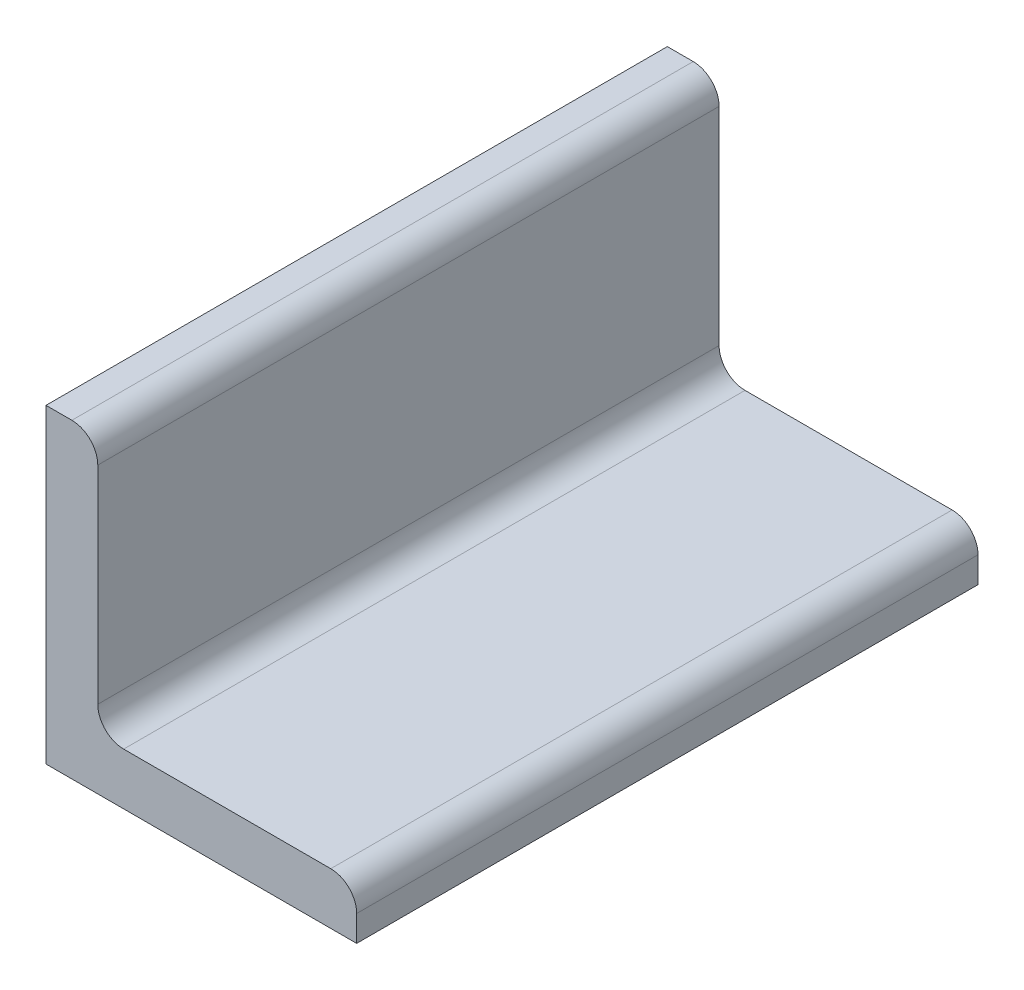
ISO-10303-21;
HEADER;
FILE_DESCRIPTION(('STEP AP214'),'2;1');
FILE_NAME('part.step','',(''),(''),'','','');
FILE_SCHEMA(('AUTOMOTIVE_DESIGN { 1 0 10303 214 1 1 1 1 }'));
ENDSEC;
DATA;
#1=APPLICATION_CONTEXT('core data for automotive mechanical design processes');
#2=APPLICATION_PROTOCOL_DEFINITION('international standard','automotive_design',2000,#1);
#3=PRODUCT_CONTEXT('',#1,'mechanical');
#4=PRODUCT('Part','Part','',(#3));
#5=PRODUCT_RELATED_PRODUCT_CATEGORY('part','',(#4));
#6=PRODUCT_DEFINITION_FORMATION('','',#4);
#7=PRODUCT_DEFINITION_CONTEXT('part definition',#1,'design');
#8=PRODUCT_DEFINITION('design','',#6,#7);
#9=PRODUCT_DEFINITION_SHAPE('','',#8);
#10=(LENGTH_UNIT() NAMED_UNIT(*) SI_UNIT(.MILLI.,.METRE.));
#11=(NAMED_UNIT(*) PLANE_ANGLE_UNIT() SI_UNIT($,.RADIAN.));
#12=(NAMED_UNIT(*) SI_UNIT($,.STERADIAN.) SOLID_ANGLE_UNIT());
#13=UNCERTAINTY_MEASURE_WITH_UNIT(LENGTH_MEASURE(1.E-05),#10,'distance_accuracy_value','');
#14=(GEOMETRIC_REPRESENTATION_CONTEXT(3) GLOBAL_UNCERTAINTY_ASSIGNED_CONTEXT((#13)) GLOBAL_UNIT_ASSIGNED_CONTEXT((#10,
#11,#12)) REPRESENTATION_CONTEXT('',''));
#15=CARTESIAN_POINT('',(0.,0.,0.));
#16=DIRECTION('',(0.,0.,1.));
#17=DIRECTION('',(1.,0.,0.));
#18=AXIS2_PLACEMENT_3D('',#15,#16,#17);
#19=CARTESIAN_POINT('',(0.425014111727251,152.925428131371,304.8));
#20=DIRECTION('',(1.,0.,0.));
#21=DIRECTION('',(0.,0.,-1.));
#22=AXIS2_PLACEMENT_3D('',#19,#20,#21);
#23=PLANE('',#22);
#24=DIRECTION('',(0.,-1.,0.));
#25=VECTOR('',#24,1.);
#26=CARTESIAN_POINT('',(0.425014111727251,152.925428131371,0.));
#27=LINE('',#26,#25);
#28=CARTESIAN_POINT('',(0.425014111727251,152.925428131371,0.));
#29=VERTEX_POINT('',#28);
#30=CARTESIAN_POINT('',(0.425014111727251,0.525428131371291,0.));
#31=VERTEX_POINT('',#30);
#32=EDGE_CURVE('E135',#29,#31,#27,.T.);
#33=ORIENTED_EDGE('',*,*,#32,.T.);
#34=DIRECTION('',(0.,0.,-1.));
#35=VECTOR('',#34,1.);
#36=CARTESIAN_POINT('',(0.425014111727251,0.525428131371291,304.8));
#37=LINE('',#36,#35);
#38=CARTESIAN_POINT('',(0.425014111727251,0.525428131371291,304.8));
#39=VERTEX_POINT('',#38);
#40=EDGE_CURVE('E11',#39,#31,#37,.T.);
#41=ORIENTED_EDGE('',*,*,#40,.F.);
#42=DIRECTION('',(0.,-1.,0.));
#43=VECTOR('',#42,1.);
#44=CARTESIAN_POINT('',(0.425014111727251,152.925428131371,304.8));
#45=LINE('',#44,#43);
#46=CARTESIAN_POINT('',(0.425014111727251,152.925428131371,304.8));
#47=VERTEX_POINT('',#46);
#48=EDGE_CURVE('E151',#47,#39,#45,.T.);
#49=ORIENTED_EDGE('',*,*,#48,.F.);
#50=DIRECTION('',(0.,0.,-1.));
#51=VECTOR('',#50,1.);
#52=CARTESIAN_POINT('',(0.425014111727251,152.925428131371,304.8));
#53=LINE('',#52,#51);
#54=EDGE_CURVE('E131',#47,#29,#53,.T.);
#55=ORIENTED_EDGE('',*,*,#54,.T.);
#56=EDGE_LOOP('',(#33,#41,#49,#55));
#57=FACE_BOUND('',#56,.T.);
#58=ADVANCED_FACE('F33',(#57),#23,.F.);
#59=CARTESIAN_POINT('',(0.425014111727251,0.525428131371291,304.8));
#60=DIRECTION('',(0.,1.,0.));
#61=DIRECTION('',(0.,0.,1.));
#62=AXIS2_PLACEMENT_3D('',#59,#60,#61);
#63=PLANE('',#62);
#64=DIRECTION('',(1.,0.,0.));
#65=VECTOR('',#64,1.);
#66=CARTESIAN_POINT('',(0.425014111727251,0.525428131371291,0.));
#67=LINE('',#66,#65);
#68=CARTESIAN_POINT('',(152.825014111727,0.525428131371291,0.));
#69=VERTEX_POINT('',#68);
#70=EDGE_CURVE('E138',#31,#69,#67,.T.);
#71=ORIENTED_EDGE('',*,*,#70,.T.);
#72=DIRECTION('',(0.,0.,-1.));
#73=VECTOR('',#72,1.);
#74=CARTESIAN_POINT('',(152.825014111727,0.525428131371291,304.8));
#75=LINE('',#74,#73);
#76=CARTESIAN_POINT('',(152.825014111727,0.525428131371291,304.8));
#77=VERTEX_POINT('',#76);
#78=EDGE_CURVE('E41',#77,#69,#75,.T.);
#79=ORIENTED_EDGE('',*,*,#78,.F.);
#80=DIRECTION('',(1.,0.,0.));
#81=VECTOR('',#80,1.);
#82=CARTESIAN_POINT('',(0.425014111727251,0.525428131371291,304.8));
#83=LINE('',#82,#81);
#84=EDGE_CURVE('E95',#39,#77,#83,.T.);
#85=ORIENTED_EDGE('',*,*,#84,.F.);
#86=ORIENTED_EDGE('',*,*,#40,.T.);
#87=EDGE_LOOP('',(#71,#79,#85,#86));
#88=FACE_BOUND('',#87,.T.);
#89=ADVANCED_FACE('F194',(#88),#63,.F.);
#90=CARTESIAN_POINT('',(152.825014111727,0.525428131371291,304.8));
#91=DIRECTION('',(-1.,0.,0.));
#92=DIRECTION('',(0.,0.,1.));
#93=AXIS2_PLACEMENT_3D('',#90,#91,#92);
#94=PLANE('',#93);
#95=DIRECTION('',(0.,1.,0.));
#96=VECTOR('',#95,1.);
#97=CARTESIAN_POINT('',(152.825014111727,0.525428131371291,0.));
#98=LINE('',#97,#96);
#99=CARTESIAN_POINT('',(152.825014111727,13.2254281313713,0.));
#100=VERTEX_POINT('',#99);
#101=EDGE_CURVE('E140',#69,#100,#98,.T.);
#102=ORIENTED_EDGE('',*,*,#101,.T.);
#103=DIRECTION('',(0.,0.,-1.));
#104=VECTOR('',#103,1.);
#105=CARTESIAN_POINT('',(152.825014111727,13.2254281313713,304.8));
#106=LINE('',#105,#104);
#107=CARTESIAN_POINT('',(152.825014111727,13.2254281313713,304.8));
#108=VERTEX_POINT('',#107);
#109=EDGE_CURVE('E161',#108,#100,#106,.T.);
#110=ORIENTED_EDGE('',*,*,#109,.F.);
#111=DIRECTION('',(0.,1.,0.));
#112=VECTOR('',#111,1.);
#113=CARTESIAN_POINT('',(152.825014111727,0.525428131371291,304.8));
#114=LINE('',#113,#112);
#115=EDGE_CURVE('E169',#77,#108,#114,.T.);
#116=ORIENTED_EDGE('',*,*,#115,.F.);
#117=ORIENTED_EDGE('',*,*,#78,.T.);
#118=EDGE_LOOP('',(#102,#110,#116,#117));
#119=FACE_BOUND('',#118,.T.);
#120=ADVANCED_FACE('F167',(#119),#94,.F.);
#121=CARTESIAN_POINT('',(140.125014111727,13.2254281313713,304.8));
#122=DIRECTION('',(0.,0.,-1.));
#123=DIRECTION('',(-1.,0.,0.));
#124=AXIS2_PLACEMENT_3D('',#121,#122,#123);
#125=CYLINDRICAL_SURFACE('',#124,12.7);
#126=CARTESIAN_POINT('',(140.125014111727,13.2254281313713,0.));
#127=DIRECTION('',(0.,0.,1.));
#128=DIRECTION('',(1.,0.,0.));
#129=AXIS2_PLACEMENT_3D('',#126,#127,#128);
#130=CIRCLE('',#129,12.7);
#131=CARTESIAN_POINT('',(140.125014111727,25.9254281313713,0.));
#132=VERTEX_POINT('',#131);
#133=EDGE_CURVE('E142',#100,#132,#130,.T.);
#134=ORIENTED_EDGE('',*,*,#133,.T.);
#135=DIRECTION('',(0.,0.,-1.));
#136=VECTOR('',#135,1.);
#137=CARTESIAN_POINT('',(140.125014111727,25.9254281313713,304.8));
#138=LINE('',#137,#136);
#139=CARTESIAN_POINT('',(140.125014111727,25.9254281313713,304.8));
#140=VERTEX_POINT('',#139);
#141=EDGE_CURVE('E158',#140,#132,#138,.T.);
#142=ORIENTED_EDGE('',*,*,#141,.F.);
#143=CARTESIAN_POINT('',(140.125014111727,13.2254281313713,304.8));
#144=DIRECTION('',(0.,0.,1.));
#145=DIRECTION('',(1.,0.,0.));
#146=AXIS2_PLACEMENT_3D('',#143,#144,#145);
#147=CIRCLE('',#146,12.7);
#148=EDGE_CURVE('E185',#108,#140,#147,.T.);
#149=ORIENTED_EDGE('',*,*,#148,.F.);
#150=ORIENTED_EDGE('',*,*,#109,.T.);
#151=EDGE_LOOP('',(#134,#142,#149,#150));
#152=FACE_BOUND('',#151,.T.);
#153=ADVANCED_FACE('F178',(#152),#125,.T.);
#154=CARTESIAN_POINT('',(140.125014111727,25.9254281313713,304.8));
#155=DIRECTION('',(0.,-1.,0.));
#156=DIRECTION('',(0.,0.,-1.));
#157=AXIS2_PLACEMENT_3D('',#154,#155,#156);
#158=PLANE('',#157);
#159=DIRECTION('',(-1.,0.,0.));
#160=VECTOR('',#159,1.);
#161=CARTESIAN_POINT('',(140.125014111727,25.9254281313713,0.));
#162=LINE('',#161,#160);
#163=CARTESIAN_POINT('',(38.5250141117273,25.9254281313713,0.));
#164=VERTEX_POINT('',#163);
#165=EDGE_CURVE('E144',#132,#164,#162,.T.);
#166=ORIENTED_EDGE('',*,*,#165,.T.);
#167=DIRECTION('',(0.,0.,-1.));
#168=VECTOR('',#167,1.);
#169=CARTESIAN_POINT('',(38.5250141117273,25.9254281313713,304.8));
#170=LINE('',#169,#168);
#171=CARTESIAN_POINT('',(38.5250141117273,25.9254281313713,304.8));
#172=VERTEX_POINT('',#171);
#173=EDGE_CURVE('E155',#172,#164,#170,.T.);
#174=ORIENTED_EDGE('',*,*,#173,.F.);
#175=DIRECTION('',(-1.,0.,0.));
#176=VECTOR('',#175,1.);
#177=CARTESIAN_POINT('',(140.125014111727,25.9254281313713,304.8));
#178=LINE('',#177,#176);
#179=EDGE_CURVE('E184',#140,#172,#178,.T.);
#180=ORIENTED_EDGE('',*,*,#179,.F.);
#181=ORIENTED_EDGE('',*,*,#141,.T.);
#182=EDGE_LOOP('',(#166,#174,#180,#181));
#183=FACE_BOUND('',#182,.T.);
#184=ADVANCED_FACE('F182',(#183),#158,.F.);
#185=CARTESIAN_POINT('',(38.5250141117272,38.6254281313713,304.8));
#186=DIRECTION('',(0.,0.,-1.));
#187=DIRECTION('',(-1.,0.,0.));
#188=AXIS2_PLACEMENT_3D('',#185,#186,#187);
#189=CYLINDRICAL_SURFACE('',#188,12.7);
#190=CARTESIAN_POINT('',(38.5250141117272,38.6254281313713,0.));
#191=DIRECTION('',(0.,0.,-1.));
#192=DIRECTION('',(1.,0.,0.));
#193=AXIS2_PLACEMENT_3D('',#190,#191,#192);
#194=CIRCLE('',#193,12.7);
#195=CARTESIAN_POINT('',(25.8250141117273,38.6254281313713,0.));
#196=VERTEX_POINT('',#195);
#197=EDGE_CURVE('E146',#164,#196,#194,.T.);
#198=ORIENTED_EDGE('',*,*,#197,.T.);
#199=DIRECTION('',(0.,0.,-1.));
#200=VECTOR('',#199,1.);
#201=CARTESIAN_POINT('',(25.8250141117273,38.6254281313713,304.8));
#202=LINE('',#201,#200);
#203=CARTESIAN_POINT('',(25.8250141117273,38.6254281313713,304.8));
#204=VERTEX_POINT('',#203);
#205=EDGE_CURVE('E126',#204,#196,#202,.T.);
#206=ORIENTED_EDGE('',*,*,#205,.F.);
#207=CARTESIAN_POINT('',(38.5250141117272,38.6254281313713,304.8));
#208=DIRECTION('',(0.,0.,-1.));
#209=DIRECTION('',(1.,0.,0.));
#210=AXIS2_PLACEMENT_3D('',#207,#208,#209);
#211=CIRCLE('',#210,12.7);
#212=EDGE_CURVE('E117',#172,#204,#211,.T.);
#213=ORIENTED_EDGE('',*,*,#212,.F.);
#214=ORIENTED_EDGE('',*,*,#173,.T.);
#215=EDGE_LOOP('',(#198,#206,#213,#214));
#216=FACE_BOUND('',#215,.T.);
#217=ADVANCED_FACE('F206',(#216),#189,.F.);
#218=CARTESIAN_POINT('',(25.8250141117272,38.6254281313713,304.8));
#219=DIRECTION('',(-1.,0.,0.));
#220=DIRECTION('',(0.,0.,1.));
#221=AXIS2_PLACEMENT_3D('',#218,#219,#220);
#222=PLANE('',#221);
#223=DIRECTION('',(0.,1.,0.));
#224=VECTOR('',#223,1.);
#225=CARTESIAN_POINT('',(25.8250141117272,38.6254281313713,0.));
#226=LINE('',#225,#224);
#227=CARTESIAN_POINT('',(25.8250141117272,140.225428131371,0.));
#228=VERTEX_POINT('',#227);
#229=EDGE_CURVE('E125',#196,#228,#226,.T.);
#230=ORIENTED_EDGE('',*,*,#229,.T.);
#231=DIRECTION('',(0.,0.,-1.));
#232=VECTOR('',#231,1.);
#233=CARTESIAN_POINT('',(25.8250141117272,140.225428131371,304.8));
#234=LINE('',#233,#232);
#235=CARTESIAN_POINT('',(25.8250141117272,140.225428131371,304.8));
#236=VERTEX_POINT('',#235);
#237=EDGE_CURVE('E122',#236,#228,#234,.T.);
#238=ORIENTED_EDGE('',*,*,#237,.F.);
#239=DIRECTION('',(0.,1.,0.));
#240=VECTOR('',#239,1.);
#241=CARTESIAN_POINT('',(25.8250141117272,38.6254281313713,304.8));
#242=LINE('',#241,#240);
#243=EDGE_CURVE('E111',#204,#236,#242,.T.);
#244=ORIENTED_EDGE('',*,*,#243,.F.);
#245=ORIENTED_EDGE('',*,*,#205,.T.);
#246=EDGE_LOOP('',(#230,#238,#244,#245));
#247=FACE_BOUND('',#246,.T.);
#248=ADVANCED_FACE('F123',(#247),#222,.F.);
#249=CARTESIAN_POINT('',(13.1250141117272,140.225428131371,304.8));
#250=DIRECTION('',(0.,0.,-1.));
#251=DIRECTION('',(-1.,0.,0.));
#252=AXIS2_PLACEMENT_3D('',#249,#250,#251);
#253=CYLINDRICAL_SURFACE('',#252,12.7);
#254=CARTESIAN_POINT('',(13.1250141117272,140.225428131371,0.));
#255=DIRECTION('',(0.,0.,1.));
#256=DIRECTION('',(1.,0.,0.));
#257=AXIS2_PLACEMENT_3D('',#254,#255,#256);
#258=CIRCLE('',#257,12.7);
#259=CARTESIAN_POINT('',(13.1250141117273,152.925428131371,0.));
#260=VERTEX_POINT('',#259);
#261=EDGE_CURVE('E81',#228,#260,#258,.T.);
#262=ORIENTED_EDGE('',*,*,#261,.T.);
#263=DIRECTION('',(0.,0.,-1.));
#264=VECTOR('',#263,1.);
#265=CARTESIAN_POINT('',(13.1250141117273,152.925428131371,304.8));
#266=LINE('',#265,#264);
#267=CARTESIAN_POINT('',(13.1250141117273,152.925428131371,304.8));
#268=VERTEX_POINT('',#267);
#269=EDGE_CURVE('E127',#268,#260,#266,.T.);
#270=ORIENTED_EDGE('',*,*,#269,.F.);
#271=CARTESIAN_POINT('',(13.1250141117272,140.225428131371,304.8));
#272=DIRECTION('',(0.,0.,1.));
#273=DIRECTION('',(1.,0.,0.));
#274=AXIS2_PLACEMENT_3D('',#271,#272,#273);
#275=CIRCLE('',#274,12.7);
#276=EDGE_CURVE('E115',#236,#268,#275,.T.);
#277=ORIENTED_EDGE('',*,*,#276,.F.);
#278=ORIENTED_EDGE('',*,*,#237,.T.);
#279=EDGE_LOOP('',(#262,#270,#277,#278));
#280=FACE_BOUND('',#279,.T.);
#281=ADVANCED_FACE('F129',(#280),#253,.T.);
#282=CARTESIAN_POINT('',(13.1250141117273,152.925428131371,304.8));
#283=DIRECTION('',(0.,-1.,0.));
#284=DIRECTION('',(0.,0.,-1.));
#285=AXIS2_PLACEMENT_3D('',#282,#283,#284);
#286=PLANE('',#285);
#287=DIRECTION('',(-1.,0.,0.));
#288=VECTOR('',#287,1.);
#289=CARTESIAN_POINT('',(13.1250141117273,152.925428131371,0.));
#290=LINE('',#289,#288);
#291=EDGE_CURVE('E87',#260,#29,#290,.T.);
#292=ORIENTED_EDGE('',*,*,#291,.T.);
#293=ORIENTED_EDGE('',*,*,#54,.F.);
#294=DIRECTION('',(-1.,0.,0.));
#295=VECTOR('',#294,1.);
#296=CARTESIAN_POINT('',(13.1250141117273,152.925428131371,304.8));
#297=LINE('',#296,#295);
#298=EDGE_CURVE('E49',#268,#47,#297,.T.);
#299=ORIENTED_EDGE('',*,*,#298,.F.);
#300=ORIENTED_EDGE('',*,*,#269,.T.);
#301=EDGE_LOOP('',(#292,#293,#299,#300));
#302=FACE_BOUND('',#301,.T.);
#303=ADVANCED_FACE('F214',(#302),#286,.F.);
#304=CARTESIAN_POINT('',(140.125014111727,13.2254281313713,304.8));
#305=DIRECTION('',(0.,0.,1.));
#306=DIRECTION('',(1.,0.,0.));
#307=AXIS2_PLACEMENT_3D('',#304,#305,#306);
#308=PLANE('',#307);
#309=ORIENTED_EDGE('',*,*,#48,.T.);
#310=ORIENTED_EDGE('',*,*,#84,.T.);
#311=ORIENTED_EDGE('',*,*,#115,.T.);
#312=ORIENTED_EDGE('',*,*,#148,.T.);
#313=ORIENTED_EDGE('',*,*,#179,.T.);
#314=ORIENTED_EDGE('',*,*,#212,.T.);
#315=ORIENTED_EDGE('',*,*,#243,.T.);
#316=ORIENTED_EDGE('',*,*,#276,.T.);
#317=ORIENTED_EDGE('',*,*,#298,.T.);
#318=EDGE_LOOP('',(#309,#310,#311,#312,#313,#314,#315,#316,#317));
#319=FACE_BOUND('',#318,.T.);
#320=ADVANCED_FACE('F113',(#319),#308,.T.);
#321=CARTESIAN_POINT('',(140.125014111727,13.2254281313713,0.));
#322=DIRECTION('',(0.,0.,1.));
#323=DIRECTION('',(1.,0.,0.));
#324=AXIS2_PLACEMENT_3D('',#321,#322,#323);
#325=PLANE('',#324);
#326=ORIENTED_EDGE('',*,*,#32,.F.);
#327=ORIENTED_EDGE('',*,*,#291,.F.);
#328=ORIENTED_EDGE('',*,*,#261,.F.);
#329=ORIENTED_EDGE('',*,*,#229,.F.);
#330=ORIENTED_EDGE('',*,*,#197,.F.);
#331=ORIENTED_EDGE('',*,*,#165,.F.);
#332=ORIENTED_EDGE('',*,*,#133,.F.);
#333=ORIENTED_EDGE('',*,*,#101,.F.);
#334=ORIENTED_EDGE('',*,*,#70,.F.);
#335=EDGE_LOOP('',(#326,#327,#328,#329,#330,#331,#332,#333,#334));
#336=FACE_BOUND('',#335,.T.);
#337=ADVANCED_FACE('F173',(#336),#325,.F.);
#338=CLOSED_SHELL('',(#58,#89,#120,#153,#184,#217,#248,#281,#303,#320,#337));
#339=MANIFOLD_SOLID_BREP('B2',#338);
#340=ADVANCED_BREP_SHAPE_REPRESENTATION('',(#18,#339),#14);
#341=SHAPE_DEFINITION_REPRESENTATION(#9,#340);
ENDSEC;
END-ISO-10303-21;
